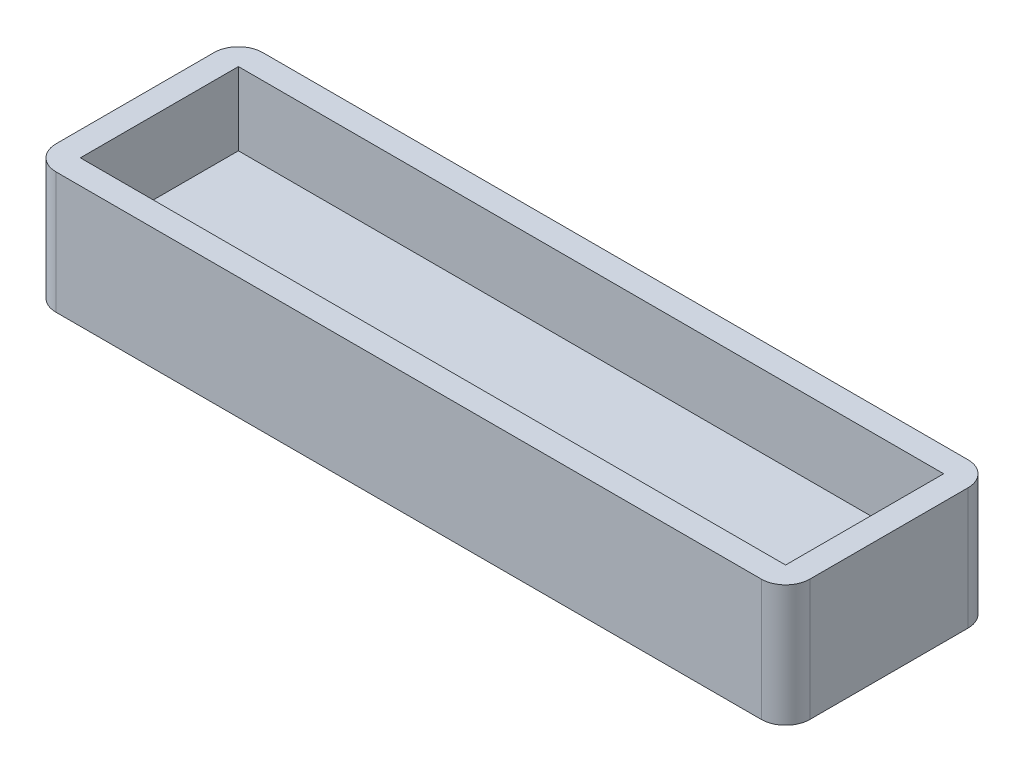
ISO-10303-21;
HEADER;
FILE_DESCRIPTION(('STEP AP214'),'2;1');
FILE_NAME('part.step','',(''),(''),'','','');
FILE_SCHEMA(('AUTOMOTIVE_DESIGN { 1 0 10303 214 1 1 1 1 }'));
ENDSEC;
DATA;
#1=APPLICATION_CONTEXT('core data for automotive mechanical design processes');
#2=APPLICATION_PROTOCOL_DEFINITION('international standard','automotive_design',2000,#1);
#3=PRODUCT_CONTEXT('',#1,'mechanical');
#4=PRODUCT('Part','Part','',(#3));
#5=PRODUCT_RELATED_PRODUCT_CATEGORY('part','',(#4));
#6=PRODUCT_DEFINITION_FORMATION('','',#4);
#7=PRODUCT_DEFINITION_CONTEXT('part definition',#1,'design');
#8=PRODUCT_DEFINITION('design','',#6,#7);
#9=PRODUCT_DEFINITION_SHAPE('','',#8);
#10=(LENGTH_UNIT() NAMED_UNIT(*) SI_UNIT(.MILLI.,.METRE.));
#11=(NAMED_UNIT(*) PLANE_ANGLE_UNIT() SI_UNIT($,.RADIAN.));
#12=(NAMED_UNIT(*) SI_UNIT($,.STERADIAN.) SOLID_ANGLE_UNIT());
#13=UNCERTAINTY_MEASURE_WITH_UNIT(LENGTH_MEASURE(1.E-05),#10,'distance_accuracy_value','');
#14=(GEOMETRIC_REPRESENTATION_CONTEXT(3) GLOBAL_UNCERTAINTY_ASSIGNED_CONTEXT((#13)) GLOBAL_UNIT_ASSIGNED_CONTEXT((#10,
#11,#12)) REPRESENTATION_CONTEXT('',''));
#15=CARTESIAN_POINT('',(0.,0.,0.));
#16=DIRECTION('',(0.,0.,1.));
#17=DIRECTION('',(1.,0.,0.));
#18=AXIS2_PLACEMENT_3D('',#15,#16,#17);
#19=CARTESIAN_POINT('',(0.,0.,85.));
#20=DIRECTION('',(1.,0.,0.));
#21=DIRECTION('',(0.,0.,-1.));
#22=AXIS2_PLACEMENT_3D('',#19,#20,#21);
#23=PLANE('',#22);
#24=DIRECTION('',(0.,0.,-1.));
#25=VECTOR('',#24,1.);
#26=CARTESIAN_POINT('',(0.,50.,85.));
#27=LINE('',#26,#25);
#28=CARTESIAN_POINT('',(0.,50.,75.));
#29=VERTEX_POINT('',#28);
#30=CARTESIAN_POINT('',(0.,50.,9.99999999999999));
#31=VERTEX_POINT('',#30);
#32=EDGE_CURVE('E257',#29,#31,#27,.T.);
#33=ORIENTED_EDGE('',*,*,#32,.T.);
#34=DIRECTION('',(0.,-1.,0.));
#35=VECTOR('',#34,1.);
#36=CARTESIAN_POINT('',(0.,0.,9.99999999999999));
#37=LINE('',#36,#35);
#38=CARTESIAN_POINT('',(0.,0.,9.99999999999999));
#39=VERTEX_POINT('',#38);
#40=EDGE_CURVE('E318',#31,#39,#37,.T.);
#41=ORIENTED_EDGE('',*,*,#40,.T.);
#42=DIRECTION('',(0.,0.,-1.));
#43=VECTOR('',#42,1.);
#44=CARTESIAN_POINT('',(0.,0.,85.));
#45=LINE('',#44,#43);
#46=CARTESIAN_POINT('',(0.,0.,75.));
#47=VERTEX_POINT('',#46);
#48=EDGE_CURVE('E272',#47,#39,#45,.T.);
#49=ORIENTED_EDGE('',*,*,#48,.F.);
#50=DIRECTION('',(0.,-1.,0.));
#51=VECTOR('',#50,1.);
#52=CARTESIAN_POINT('',(0.,0.,75.));
#53=LINE('',#52,#51);
#54=EDGE_CURVE('E312',#47,#29,#53,.F.);
#55=ORIENTED_EDGE('',*,*,#54,.T.);
#56=EDGE_LOOP('',(#33,#41,#49,#55));
#57=FACE_BOUND('',#56,.T.);
#58=ADVANCED_FACE('F39',(#57),#23,.F.);
#59=CARTESIAN_POINT('',(0.,0.,85.));
#60=DIRECTION('',(0.,1.,0.));
#61=DIRECTION('',(0.,0.,1.));
#62=AXIS2_PLACEMENT_3D('',#59,#60,#61);
#63=PLANE('',#62);
#64=ORIENTED_EDGE('',*,*,#48,.T.);
#65=CARTESIAN_POINT('',(10.,0.,9.99999999999999));
#66=DIRECTION('',(0.,1.,0.));
#67=DIRECTION('',(0.,0.,1.));
#68=AXIS2_PLACEMENT_3D('',#65,#66,#67);
#69=CIRCLE('',#68,10.);
#70=CARTESIAN_POINT('',(10.,0.,0.));
#71=VERTEX_POINT('',#70);
#72=EDGE_CURVE('E322',#39,#71,#69,.F.);
#73=ORIENTED_EDGE('',*,*,#72,.T.);
#74=DIRECTION('',(1.,0.,0.));
#75=VECTOR('',#74,1.);
#76=CARTESIAN_POINT('',(0.,0.,0.));
#77=LINE('',#76,#75);
#78=CARTESIAN_POINT('',(300.,0.,0.));
#79=VERTEX_POINT('',#78);
#80=EDGE_CURVE('E239',#71,#79,#77,.T.);
#81=ORIENTED_EDGE('',*,*,#80,.T.);
#82=CARTESIAN_POINT('',(300.,0.,9.99999999999999));
#83=DIRECTION('',(0.,1.,0.));
#84=DIRECTION('',(0.,0.,1.));
#85=AXIS2_PLACEMENT_3D('',#82,#83,#84);
#86=CIRCLE('',#85,10.);
#87=CARTESIAN_POINT('',(310.,0.,9.99999999999999));
#88=VERTEX_POINT('',#87);
#89=EDGE_CURVE('E287',#79,#88,#86,.F.);
#90=ORIENTED_EDGE('',*,*,#89,.T.);
#91=DIRECTION('',(0.,0.,-1.));
#92=VECTOR('',#91,1.);
#93=CARTESIAN_POINT('',(310.,0.,85.));
#94=LINE('',#93,#92);
#95=CARTESIAN_POINT('',(310.,0.,75.));
#96=VERTEX_POINT('',#95);
#97=EDGE_CURVE('E269',#96,#88,#94,.T.);
#98=ORIENTED_EDGE('',*,*,#97,.F.);
#99=CARTESIAN_POINT('',(300.,0.,75.));
#100=DIRECTION('',(0.,1.,0.));
#101=DIRECTION('',(0.,0.,1.));
#102=AXIS2_PLACEMENT_3D('',#99,#100,#101);
#103=CIRCLE('',#102,10.);
#104=CARTESIAN_POINT('',(300.,0.,85.));
#105=VERTEX_POINT('',#104);
#106=EDGE_CURVE('E301',#96,#105,#103,.F.);
#107=ORIENTED_EDGE('',*,*,#106,.T.);
#108=DIRECTION('',(1.,0.,0.));
#109=VECTOR('',#108,1.);
#110=CARTESIAN_POINT('',(0.,0.,85.));
#111=LINE('',#110,#109);
#112=CARTESIAN_POINT('',(10.,0.,85.));
#113=VERTEX_POINT('',#112);
#114=EDGE_CURVE('E249',#113,#105,#111,.T.);
#115=ORIENTED_EDGE('',*,*,#114,.F.);
#116=CARTESIAN_POINT('',(10.,0.,75.));
#117=DIRECTION('',(0.,1.,0.));
#118=DIRECTION('',(0.,0.,1.));
#119=AXIS2_PLACEMENT_3D('',#116,#117,#118);
#120=CIRCLE('',#119,10.);
#121=EDGE_CURVE('E309',#113,#47,#120,.F.);
#122=ORIENTED_EDGE('',*,*,#121,.T.);
#123=EDGE_LOOP('',(#64,#73,#81,#90,#98,#107,#115,#122));
#124=FACE_BOUND('',#123,.T.);
#125=ADVANCED_FACE('F342',(#124),#63,.F.);
#126=CARTESIAN_POINT('',(310.,0.,85.));
#127=DIRECTION('',(-1.,0.,0.));
#128=DIRECTION('',(0.,0.,1.));
#129=AXIS2_PLACEMENT_3D('',#126,#127,#128);
#130=PLANE('',#129);
#131=DIRECTION('',(0.,0.,-1.));
#132=VECTOR('',#131,1.);
#133=CARTESIAN_POINT('',(310.,50.,85.));
#134=LINE('',#133,#132);
#135=CARTESIAN_POINT('',(310.,50.,75.));
#136=VERTEX_POINT('',#135);
#137=CARTESIAN_POINT('',(310.,50.,9.99999999999999));
#138=VERTEX_POINT('',#137);
#139=EDGE_CURVE('E266',#136,#138,#134,.T.);
#140=ORIENTED_EDGE('',*,*,#139,.F.);
#141=DIRECTION('',(0.,1.,0.));
#142=VECTOR('',#141,1.);
#143=CARTESIAN_POINT('',(310.,0.,75.));
#144=LINE('',#143,#142);
#145=EDGE_CURVE('E298',#136,#96,#144,.F.);
#146=ORIENTED_EDGE('',*,*,#145,.T.);
#147=ORIENTED_EDGE('',*,*,#97,.T.);
#148=DIRECTION('',(0.,1.,0.));
#149=VECTOR('',#148,1.);
#150=CARTESIAN_POINT('',(310.,50.,9.99999999999999));
#151=LINE('',#150,#149);
#152=EDGE_CURVE('E276',#88,#138,#151,.T.);
#153=ORIENTED_EDGE('',*,*,#152,.T.);
#154=EDGE_LOOP('',(#140,#146,#147,#153));
#155=FACE_BOUND('',#154,.T.);
#156=ADVANCED_FACE('F356',(#155),#130,.F.);
#157=CARTESIAN_POINT('',(0.,50.,85.));
#158=DIRECTION('',(0.,-1.,0.));
#159=DIRECTION('',(0.,0.,-1.));
#160=AXIS2_PLACEMENT_3D('',#157,#158,#159);
#161=PLANE('',#160);
#162=DIRECTION('',(1.,0.,0.));
#163=VECTOR('',#162,1.);
#164=CARTESIAN_POINT('',(10.,50.,75.));
#165=LINE('',#164,#163);
#166=CARTESIAN_POINT('',(10.,50.,75.));
#167=VERTEX_POINT('',#166);
#168=CARTESIAN_POINT('',(300.,50.,75.));
#169=VERTEX_POINT('',#168);
#170=EDGE_CURVE('E225',#167,#169,#165,.T.);
#171=ORIENTED_EDGE('',*,*,#170,.F.);
#172=DIRECTION('',(0.,0.,1.));
#173=VECTOR('',#172,1.);
#174=CARTESIAN_POINT('',(10.,50.,10.));
#175=LINE('',#174,#173);
#176=CARTESIAN_POINT('',(10.,50.,10.));
#177=VERTEX_POINT('',#176);
#178=EDGE_CURVE('E199',#177,#167,#175,.T.);
#179=ORIENTED_EDGE('',*,*,#178,.F.);
#180=DIRECTION('',(-1.,0.,0.));
#181=VECTOR('',#180,1.);
#182=CARTESIAN_POINT('',(10.,50.,10.));
#183=LINE('',#182,#181);
#184=CARTESIAN_POINT('',(300.,50.,10.));
#185=VERTEX_POINT('',#184);
#186=EDGE_CURVE('E210',#185,#177,#183,.T.);
#187=ORIENTED_EDGE('',*,*,#186,.F.);
#188=DIRECTION('',(0.,0.,-1.));
#189=VECTOR('',#188,1.);
#190=CARTESIAN_POINT('',(300.,50.,10.));
#191=LINE('',#190,#189);
#192=EDGE_CURVE('E229',#169,#185,#191,.T.);
#193=ORIENTED_EDGE('',*,*,#192,.F.);
#194=EDGE_LOOP('',(#171,#179,#187,#193));
#195=FACE_BOUND('',#194,.T.);
#196=DIRECTION('',(-1.,0.,0.));
#197=VECTOR('',#196,1.);
#198=CARTESIAN_POINT('',(0.,50.,0.));
#199=LINE('',#198,#197);
#200=CARTESIAN_POINT('',(300.,50.,0.));
#201=VERTEX_POINT('',#200);
#202=CARTESIAN_POINT('',(10.,50.,0.));
#203=VERTEX_POINT('',#202);
#204=EDGE_CURVE('E253',#201,#203,#199,.T.);
#205=ORIENTED_EDGE('',*,*,#204,.T.);
#206=CARTESIAN_POINT('',(10.,50.,9.99999999999999));
#207=DIRECTION('',(0.,-1.,0.));
#208=DIRECTION('',(0.,0.,-1.));
#209=AXIS2_PLACEMENT_3D('',#206,#207,#208);
#210=CIRCLE('',#209,10.);
#211=EDGE_CURVE('E11',#203,#31,#210,.F.);
#212=ORIENTED_EDGE('',*,*,#211,.T.);
#213=ORIENTED_EDGE('',*,*,#32,.F.);
#214=CARTESIAN_POINT('',(10.,50.,75.));
#215=DIRECTION('',(0.,-1.,0.));
#216=DIRECTION('',(0.,0.,-1.));
#217=AXIS2_PLACEMENT_3D('',#214,#215,#216);
#218=CIRCLE('',#217,10.);
#219=CARTESIAN_POINT('',(10.,50.,85.));
#220=VERTEX_POINT('',#219);
#221=EDGE_CURVE('E315',#29,#220,#218,.F.);
#222=ORIENTED_EDGE('',*,*,#221,.T.);
#223=DIRECTION('',(-1.,0.,0.));
#224=VECTOR('',#223,1.);
#225=CARTESIAN_POINT('',(0.,50.,85.));
#226=LINE('',#225,#224);
#227=CARTESIAN_POINT('',(300.,50.,85.));
#228=VERTEX_POINT('',#227);
#229=EDGE_CURVE('E252',#228,#220,#226,.T.);
#230=ORIENTED_EDGE('',*,*,#229,.F.);
#231=CARTESIAN_POINT('',(300.,50.,75.));
#232=DIRECTION('',(0.,-1.,0.));
#233=DIRECTION('',(0.,0.,-1.));
#234=AXIS2_PLACEMENT_3D('',#231,#232,#233);
#235=CIRCLE('',#234,10.);
#236=EDGE_CURVE('E295',#228,#136,#235,.F.);
#237=ORIENTED_EDGE('',*,*,#236,.T.);
#238=ORIENTED_EDGE('',*,*,#139,.T.);
#239=CARTESIAN_POINT('',(300.,50.,9.99999999999999));
#240=DIRECTION('',(0.,-1.,0.));
#241=DIRECTION('',(0.,0.,-1.));
#242=AXIS2_PLACEMENT_3D('',#239,#240,#241);
#243=CIRCLE('',#242,10.);
#244=EDGE_CURVE('E280',#138,#201,#243,.F.);
#245=ORIENTED_EDGE('',*,*,#244,.T.);
#246=EDGE_LOOP('',(#205,#212,#213,#222,#230,#237,#238,#245));
#247=FACE_BOUND('',#246,.T.);
#248=ADVANCED_FACE('F334',(#195,#247),#161,.F.);
#249=CARTESIAN_POINT('',(0.,0.,85.));
#250=DIRECTION('',(0.,0.,-1.));
#251=DIRECTION('',(-1.,0.,0.));
#252=AXIS2_PLACEMENT_3D('',#249,#250,#251);
#253=PLANE('',#252);
#254=ORIENTED_EDGE('',*,*,#229,.T.);
#255=DIRECTION('',(0.,-1.,0.));
#256=VECTOR('',#255,1.);
#257=CARTESIAN_POINT('',(10.,0.,85.));
#258=LINE('',#257,#256);
#259=EDGE_CURVE('E305',#220,#113,#258,.T.);
#260=ORIENTED_EDGE('',*,*,#259,.T.);
#261=ORIENTED_EDGE('',*,*,#114,.T.);
#262=DIRECTION('',(0.,1.,0.));
#263=VECTOR('',#262,1.);
#264=CARTESIAN_POINT('',(300.,0.,85.));
#265=LINE('',#264,#263);
#266=EDGE_CURVE('E291',#105,#228,#265,.T.);
#267=ORIENTED_EDGE('',*,*,#266,.T.);
#268=EDGE_LOOP('',(#254,#260,#261,#267));
#269=FACE_BOUND('',#268,.T.);
#270=ADVANCED_FACE('F349',(#269),#253,.F.);
#271=CARTESIAN_POINT('',(0.,0.,0.));
#272=DIRECTION('',(0.,0.,-1.));
#273=DIRECTION('',(-1.,0.,0.));
#274=AXIS2_PLACEMENT_3D('',#271,#272,#273);
#275=PLANE('',#274);
#276=DIRECTION('',(0.,-1.,0.));
#277=VECTOR('',#276,1.);
#278=CARTESIAN_POINT('',(290.,29.,0.));
#279=LINE('',#278,#277);
#280=CARTESIAN_POINT('',(290.,29.,0.));
#281=VERTEX_POINT('',#280);
#282=CARTESIAN_POINT('',(290.,25.,0.));
#283=VERTEX_POINT('',#282);
#284=EDGE_CURVE('E55',#281,#283,#279,.T.);
#285=ORIENTED_EDGE('',*,*,#284,.F.);
#286=DIRECTION('',(1.,0.,0.));
#287=VECTOR('',#286,1.);
#288=CARTESIAN_POINT('',(290.,29.,0.));
#289=LINE('',#288,#287);
#290=CARTESIAN_POINT('',(282.,29.,0.));
#291=VERTEX_POINT('',#290);
#292=EDGE_CURVE('E173',#291,#281,#289,.T.);
#293=ORIENTED_EDGE('',*,*,#292,.F.);
#294=DIRECTION('',(0.,1.,0.));
#295=VECTOR('',#294,1.);
#296=CARTESIAN_POINT('',(282.,29.,0.));
#297=LINE('',#296,#295);
#298=CARTESIAN_POINT('',(282.,25.,0.));
#299=VERTEX_POINT('',#298);
#300=EDGE_CURVE('E177',#299,#291,#297,.T.);
#301=ORIENTED_EDGE('',*,*,#300,.F.);
#302=DIRECTION('',(-1.,0.,0.));
#303=VECTOR('',#302,1.);
#304=CARTESIAN_POINT('',(290.,25.,0.));
#305=LINE('',#304,#303);
#306=EDGE_CURVE('E189',#283,#299,#305,.T.);
#307=ORIENTED_EDGE('',*,*,#306,.F.);
#308=EDGE_LOOP('',(#285,#293,#301,#307));
#309=FACE_BOUND('',#308,.T.);
#310=ORIENTED_EDGE('',*,*,#80,.F.);
#311=DIRECTION('',(0.,-1.,0.));
#312=VECTOR('',#311,1.);
#313=CARTESIAN_POINT('',(10.,50.,0.));
#314=LINE('',#313,#312);
#315=EDGE_CURVE('E48',#71,#203,#314,.F.);
#316=ORIENTED_EDGE('',*,*,#315,.T.);
#317=ORIENTED_EDGE('',*,*,#204,.F.);
#318=DIRECTION('',(0.,1.,0.));
#319=VECTOR('',#318,1.);
#320=CARTESIAN_POINT('',(300.,0.,0.));
#321=LINE('',#320,#319);
#322=EDGE_CURVE('E283',#201,#79,#321,.F.);
#323=ORIENTED_EDGE('',*,*,#322,.T.);
#324=EDGE_LOOP('',(#310,#316,#317,#323));
#325=FACE_BOUND('',#324,.T.);
#326=ADVANCED_FACE('F329',(#309,#325),#275,.T.);
#327=CARTESIAN_POINT('',(10.,20.,10.));
#328=DIRECTION('',(-1.,0.,0.));
#329=DIRECTION('',(0.,0.,1.));
#330=AXIS2_PLACEMENT_3D('',#327,#328,#329);
#331=PLANE('',#330);
#332=ORIENTED_EDGE('',*,*,#178,.T.);
#333=DIRECTION('',(0.,1.,0.));
#334=VECTOR('',#333,1.);
#335=CARTESIAN_POINT('',(10.,20.,75.));
#336=LINE('',#335,#334);
#337=CARTESIAN_POINT('',(10.,20.,75.));
#338=VERTEX_POINT('',#337);
#339=EDGE_CURVE('E222',#338,#167,#336,.T.);
#340=ORIENTED_EDGE('',*,*,#339,.F.);
#341=DIRECTION('',(0.,0.,1.));
#342=VECTOR('',#341,1.);
#343=CARTESIAN_POINT('',(10.,20.,10.));
#344=LINE('',#343,#342);
#345=CARTESIAN_POINT('',(10.,20.,10.));
#346=VERTEX_POINT('',#345);
#347=EDGE_CURVE('E205',#346,#338,#344,.T.);
#348=ORIENTED_EDGE('',*,*,#347,.F.);
#349=DIRECTION('',(0.,1.,0.));
#350=VECTOR('',#349,1.);
#351=CARTESIAN_POINT('',(10.,20.,10.));
#352=LINE('',#351,#350);
#353=EDGE_CURVE('E236',#346,#177,#352,.T.);
#354=ORIENTED_EDGE('',*,*,#353,.T.);
#355=EDGE_LOOP('',(#332,#340,#348,#354));
#356=FACE_BOUND('',#355,.T.);
#357=ADVANCED_FACE('F389',(#356),#331,.F.);
#358=CARTESIAN_POINT('',(10.,20.,10.));
#359=DIRECTION('',(0.,0.,-1.));
#360=DIRECTION('',(-1.,0.,0.));
#361=AXIS2_PLACEMENT_3D('',#358,#359,#360);
#362=PLANE('',#361);
#363=DIRECTION('',(1.,0.,0.));
#364=VECTOR('',#363,1.);
#365=CARTESIAN_POINT('',(290.,29.,10.));
#366=LINE('',#365,#364);
#367=CARTESIAN_POINT('',(282.,29.,10.));
#368=VERTEX_POINT('',#367);
#369=CARTESIAN_POINT('',(290.,29.,10.));
#370=VERTEX_POINT('',#369);
#371=EDGE_CURVE('E161',#368,#370,#366,.T.);
#372=ORIENTED_EDGE('',*,*,#371,.T.);
#373=DIRECTION('',(0.,-1.,0.));
#374=VECTOR('',#373,1.);
#375=CARTESIAN_POINT('',(290.,29.,10.));
#376=LINE('',#375,#374);
#377=CARTESIAN_POINT('',(290.,25.,10.));
#378=VERTEX_POINT('',#377);
#379=EDGE_CURVE('E154',#370,#378,#376,.T.);
#380=ORIENTED_EDGE('',*,*,#379,.T.);
#381=DIRECTION('',(-1.,0.,0.));
#382=VECTOR('',#381,1.);
#383=CARTESIAN_POINT('',(290.,25.,10.));
#384=LINE('',#383,#382);
#385=CARTESIAN_POINT('',(282.,25.,10.));
#386=VERTEX_POINT('',#385);
#387=EDGE_CURVE('E164',#378,#386,#384,.T.);
#388=ORIENTED_EDGE('',*,*,#387,.T.);
#389=DIRECTION('',(0.,1.,0.));
#390=VECTOR('',#389,1.);
#391=CARTESIAN_POINT('',(282.,29.,10.));
#392=LINE('',#391,#390);
#393=EDGE_CURVE('E63',#386,#368,#392,.T.);
#394=ORIENTED_EDGE('',*,*,#393,.T.);
#395=EDGE_LOOP('',(#372,#380,#388,#394));
#396=FACE_BOUND('',#395,.T.);
#397=ORIENTED_EDGE('',*,*,#186,.T.);
#398=ORIENTED_EDGE('',*,*,#353,.F.);
#399=DIRECTION('',(-1.,0.,0.));
#400=VECTOR('',#399,1.);
#401=CARTESIAN_POINT('',(10.,20.,10.));
#402=LINE('',#401,#400);
#403=CARTESIAN_POINT('',(300.,20.,10.));
#404=VERTEX_POINT('',#403);
#405=EDGE_CURVE('E218',#404,#346,#402,.T.);
#406=ORIENTED_EDGE('',*,*,#405,.F.);
#407=DIRECTION('',(0.,1.,0.));
#408=VECTOR('',#407,1.);
#409=CARTESIAN_POINT('',(300.,20.,10.));
#410=LINE('',#409,#408);
#411=EDGE_CURVE('E240',#404,#185,#410,.T.);
#412=ORIENTED_EDGE('',*,*,#411,.T.);
#413=EDGE_LOOP('',(#397,#398,#406,#412));
#414=FACE_BOUND('',#413,.T.);
#415=ADVANCED_FACE('F169',(#396,#414),#362,.F.);
#416=CARTESIAN_POINT('',(300.,20.,10.));
#417=DIRECTION('',(1.,0.,0.));
#418=DIRECTION('',(0.,0.,-1.));
#419=AXIS2_PLACEMENT_3D('',#416,#417,#418);
#420=PLANE('',#419);
#421=ORIENTED_EDGE('',*,*,#192,.T.);
#422=ORIENTED_EDGE('',*,*,#411,.F.);
#423=DIRECTION('',(0.,0.,-1.));
#424=VECTOR('',#423,1.);
#425=CARTESIAN_POINT('',(300.,20.,10.));
#426=LINE('',#425,#424);
#427=CARTESIAN_POINT('',(300.,20.,75.));
#428=VERTEX_POINT('',#427);
#429=EDGE_CURVE('E214',#428,#404,#426,.T.);
#430=ORIENTED_EDGE('',*,*,#429,.F.);
#431=DIRECTION('',(0.,1.,0.));
#432=VECTOR('',#431,1.);
#433=CARTESIAN_POINT('',(300.,20.,75.));
#434=LINE('',#433,#432);
#435=EDGE_CURVE('E243',#428,#169,#434,.T.);
#436=ORIENTED_EDGE('',*,*,#435,.T.);
#437=EDGE_LOOP('',(#421,#422,#430,#436));
#438=FACE_BOUND('',#437,.T.);
#439=ADVANCED_FACE('F398',(#438),#420,.F.);
#440=CARTESIAN_POINT('',(10.,20.,75.));
#441=DIRECTION('',(0.,0.,1.));
#442=DIRECTION('',(1.,0.,0.));
#443=AXIS2_PLACEMENT_3D('',#440,#441,#442);
#444=PLANE('',#443);
#445=ORIENTED_EDGE('',*,*,#170,.T.);
#446=ORIENTED_EDGE('',*,*,#435,.F.);
#447=DIRECTION('',(1.,0.,0.));
#448=VECTOR('',#447,1.);
#449=CARTESIAN_POINT('',(10.,20.,75.));
#450=LINE('',#449,#448);
#451=EDGE_CURVE('E209',#338,#428,#450,.T.);
#452=ORIENTED_EDGE('',*,*,#451,.F.);
#453=ORIENTED_EDGE('',*,*,#339,.T.);
#454=EDGE_LOOP('',(#445,#446,#452,#453));
#455=FACE_BOUND('',#454,.T.);
#456=ADVANCED_FACE('F372',(#455),#444,.F.);
#457=CARTESIAN_POINT('',(0.,20.,0.));
#458=DIRECTION('',(0.,1.,0.));
#459=DIRECTION('',(0.,0.,1.));
#460=AXIS2_PLACEMENT_3D('',#457,#458,#459);
#461=PLANE('',#460);
#462=CARTESIAN_POINT('',(286.,20.,15.));
#463=DIRECTION('',(0.,1.,0.));
#464=DIRECTION('',(0.,0.,1.));
#465=AXIS2_PLACEMENT_3D('',#462,#463,#464);
#466=CIRCLE('',#465,1.50000000000002);
#467=CARTESIAN_POINT('',(286.,20.,16.5));
#468=VERTEX_POINT('',#467);
#469=EDGE_CURVE('E436',#468,#468,#466,.T.);
#470=ORIENTED_EDGE('',*,*,#469,.F.);
#471=EDGE_LOOP('',(#470));
#472=FACE_BOUND('',#471,.T.);
#473=CARTESIAN_POINT('',(286.,20.,70.));
#474=DIRECTION('',(0.,1.,0.));
#475=DIRECTION('',(0.,0.,1.));
#476=AXIS2_PLACEMENT_3D('',#473,#474,#475);
#477=CIRCLE('',#476,1.50000000000002);
#478=CARTESIAN_POINT('',(286.,20.,71.5));
#479=VERTEX_POINT('',#478);
#480=EDGE_CURVE('E180',#479,#479,#477,.T.);
#481=ORIENTED_EDGE('',*,*,#480,.F.);
#482=EDGE_LOOP('',(#481));
#483=FACE_BOUND('',#482,.T.);
#484=ORIENTED_EDGE('',*,*,#347,.T.);
#485=ORIENTED_EDGE('',*,*,#451,.T.);
#486=ORIENTED_EDGE('',*,*,#429,.T.);
#487=ORIENTED_EDGE('',*,*,#405,.T.);
#488=EDGE_LOOP('',(#484,#485,#486,#487));
#489=FACE_BOUND('',#488,.T.);
#490=ADVANCED_FACE('F365',(#472,#483,#489),#461,.T.);
#491=CARTESIAN_POINT('',(300.,0.,9.99999999999999));
#492=DIRECTION('',(0.,-1.,0.));
#493=DIRECTION('',(0.,0.,-1.));
#494=AXIS2_PLACEMENT_3D('',#491,#492,#493);
#495=CYLINDRICAL_SURFACE('',#494,10.);
#496=ORIENTED_EDGE('',*,*,#89,.F.);
#497=ORIENTED_EDGE('',*,*,#322,.F.);
#498=ORIENTED_EDGE('',*,*,#244,.F.);
#499=ORIENTED_EDGE('',*,*,#152,.F.);
#500=EDGE_LOOP('',(#496,#497,#498,#499));
#501=FACE_BOUND('',#500,.T.);
#502=ADVANCED_FACE('F363',(#501),#495,.T.);
#503=CARTESIAN_POINT('',(300.,0.,75.));
#504=DIRECTION('',(0.,1.,0.));
#505=DIRECTION('',(0.,0.,1.));
#506=AXIS2_PLACEMENT_3D('',#503,#504,#505);
#507=CYLINDRICAL_SURFACE('',#506,10.);
#508=ORIENTED_EDGE('',*,*,#106,.F.);
#509=ORIENTED_EDGE('',*,*,#145,.F.);
#510=ORIENTED_EDGE('',*,*,#236,.F.);
#511=ORIENTED_EDGE('',*,*,#266,.F.);
#512=EDGE_LOOP('',(#508,#509,#510,#511));
#513=FACE_BOUND('',#512,.T.);
#514=ADVANCED_FACE('F360',(#513),#507,.T.);
#515=CARTESIAN_POINT('',(10.,0.,75.));
#516=DIRECTION('',(0.,-1.,0.));
#517=DIRECTION('',(0.,0.,-1.));
#518=AXIS2_PLACEMENT_3D('',#515,#516,#517);
#519=CYLINDRICAL_SURFACE('',#518,10.);
#520=ORIENTED_EDGE('',*,*,#221,.F.);
#521=ORIENTED_EDGE('',*,*,#54,.F.);
#522=ORIENTED_EDGE('',*,*,#121,.F.);
#523=ORIENTED_EDGE('',*,*,#259,.F.);
#524=EDGE_LOOP('',(#520,#521,#522,#523));
#525=FACE_BOUND('',#524,.T.);
#526=ADVANCED_FACE('F347',(#525),#519,.T.);
#527=CARTESIAN_POINT('',(10.,0.,9.99999999999999));
#528=DIRECTION('',(0.,1.,0.));
#529=DIRECTION('',(0.,0.,1.));
#530=AXIS2_PLACEMENT_3D('',#527,#528,#529);
#531=CYLINDRICAL_SURFACE('',#530,10.);
#532=ORIENTED_EDGE('',*,*,#211,.F.);
#533=ORIENTED_EDGE('',*,*,#315,.F.);
#534=ORIENTED_EDGE('',*,*,#72,.F.);
#535=ORIENTED_EDGE('',*,*,#40,.F.);
#536=EDGE_LOOP('',(#532,#533,#534,#535));
#537=FACE_BOUND('',#536,.T.);
#538=ADVANCED_FACE('F41',(#537),#531,.T.);
#539=CARTESIAN_POINT('',(290.,29.,10.));
#540=DIRECTION('',(1.,0.,0.));
#541=DIRECTION('',(0.,0.,-1.));
#542=AXIS2_PLACEMENT_3D('',#539,#540,#541);
#543=PLANE('',#542);
#544=ORIENTED_EDGE('',*,*,#284,.T.);
#545=DIRECTION('',(0.,0.,-1.));
#546=VECTOR('',#545,1.);
#547=CARTESIAN_POINT('',(290.,25.,10.));
#548=LINE('',#547,#546);
#549=EDGE_CURVE('E150',#378,#283,#548,.T.);
#550=ORIENTED_EDGE('',*,*,#549,.F.);
#551=ORIENTED_EDGE('',*,*,#379,.F.);
#552=DIRECTION('',(0.,0.,-1.));
#553=VECTOR('',#552,1.);
#554=CARTESIAN_POINT('',(290.,29.,10.));
#555=LINE('',#554,#553);
#556=EDGE_CURVE('E196',#370,#281,#555,.T.);
#557=ORIENTED_EDGE('',*,*,#556,.T.);
#558=EDGE_LOOP('',(#544,#550,#551,#557));
#559=FACE_BOUND('',#558,.T.);
#560=ADVANCED_FACE('F152',(#559),#543,.F.);
#561=CARTESIAN_POINT('',(290.,29.,10.));
#562=DIRECTION('',(0.,1.,0.));
#563=DIRECTION('',(0.,0.,1.));
#564=AXIS2_PLACEMENT_3D('',#561,#562,#563);
#565=PLANE('',#564);
#566=ORIENTED_EDGE('',*,*,#292,.T.);
#567=ORIENTED_EDGE('',*,*,#556,.F.);
#568=ORIENTED_EDGE('',*,*,#371,.F.);
#569=DIRECTION('',(0.,0.,-1.));
#570=VECTOR('',#569,1.);
#571=CARTESIAN_POINT('',(282.,29.,10.));
#572=LINE('',#571,#570);
#573=EDGE_CURVE('E200',#368,#291,#572,.T.);
#574=ORIENTED_EDGE('',*,*,#573,.T.);
#575=EDGE_LOOP('',(#566,#567,#568,#574));
#576=FACE_BOUND('',#575,.T.);
#577=ADVANCED_FACE('F407',(#576),#565,.F.);
#578=CARTESIAN_POINT('',(282.,29.,10.));
#579=DIRECTION('',(-1.,0.,0.));
#580=DIRECTION('',(0.,0.,1.));
#581=AXIS2_PLACEMENT_3D('',#578,#579,#580);
#582=PLANE('',#581);
#583=ORIENTED_EDGE('',*,*,#300,.T.);
#584=ORIENTED_EDGE('',*,*,#573,.F.);
#585=ORIENTED_EDGE('',*,*,#393,.F.);
#586=DIRECTION('',(0.,0.,-1.));
#587=VECTOR('',#586,1.);
#588=CARTESIAN_POINT('',(282.,25.,10.));
#589=LINE('',#588,#587);
#590=EDGE_CURVE('E160',#386,#299,#589,.T.);
#591=ORIENTED_EDGE('',*,*,#590,.T.);
#592=EDGE_LOOP('',(#583,#584,#585,#591));
#593=FACE_BOUND('',#592,.T.);
#594=ADVANCED_FACE('F411',(#593),#582,.F.);
#595=CARTESIAN_POINT('',(290.,25.,10.));
#596=DIRECTION('',(0.,-1.,0.));
#597=DIRECTION('',(0.,0.,-1.));
#598=AXIS2_PLACEMENT_3D('',#595,#596,#597);
#599=PLANE('',#598);
#600=ORIENTED_EDGE('',*,*,#306,.T.);
#601=ORIENTED_EDGE('',*,*,#590,.F.);
#602=ORIENTED_EDGE('',*,*,#387,.F.);
#603=ORIENTED_EDGE('',*,*,#549,.T.);
#604=EDGE_LOOP('',(#600,#601,#602,#603));
#605=FACE_BOUND('',#604,.T.);
#606=ADVANCED_FACE('F165',(#605),#599,.F.);
#607=CARTESIAN_POINT('',(286.,14.,70.));
#608=DIRECTION('',(0.,1.,0.));
#609=DIRECTION('',(0.,0.,1.));
#610=AXIS2_PLACEMENT_3D('',#607,#608,#609);
#611=CYLINDRICAL_SURFACE('',#610,1.50000000000002);
#612=CARTESIAN_POINT('',(286.,14.,70.));
#613=DIRECTION('',(0.,1.,0.));
#614=DIRECTION('',(0.,0.,1.));
#615=AXIS2_PLACEMENT_3D('',#612,#613,#614);
#616=CIRCLE('',#615,1.50000000000002);
#617=CARTESIAN_POINT('',(286.,14.,71.5));
#618=VERTEX_POINT('',#617);
#619=EDGE_CURVE('E440',#618,#618,#616,.T.);
#620=ORIENTED_EDGE('',*,*,#619,.F.);
#621=EDGE_LOOP('',(#620));
#622=FACE_BOUND('',#621,.T.);
#623=ORIENTED_EDGE('',*,*,#480,.T.);
#624=EDGE_LOOP('',(#623));
#625=FACE_BOUND('',#624,.T.);
#626=ADVANCED_FACE('F410',(#622,#625),#611,.F.);
#627=CARTESIAN_POINT('',(286.,14.,70.));
#628=DIRECTION('',(0.,1.,0.));
#629=DIRECTION('',(0.,0.,1.));
#630=AXIS2_PLACEMENT_3D('',#627,#628,#629);
#631=PLANE('',#630);
#632=ORIENTED_EDGE('',*,*,#619,.T.);
#633=EDGE_LOOP('',(#632));
#634=FACE_BOUND('',#633,.T.);
#635=ADVANCED_FACE('F419',(#634),#631,.T.);
#636=CARTESIAN_POINT('',(286.,14.,15.));
#637=DIRECTION('',(0.,1.,0.));
#638=DIRECTION('',(0.,0.,1.));
#639=AXIS2_PLACEMENT_3D('',#636,#637,#638);
#640=CYLINDRICAL_SURFACE('',#639,1.50000000000002);
#641=CARTESIAN_POINT('',(286.,14.,15.));
#642=DIRECTION('',(0.,1.,0.));
#643=DIRECTION('',(0.,0.,1.));
#644=AXIS2_PLACEMENT_3D('',#641,#642,#643);
#645=CIRCLE('',#644,1.50000000000002);
#646=CARTESIAN_POINT('',(286.,14.,16.5));
#647=VERTEX_POINT('',#646);
#648=EDGE_CURVE('E190',#647,#647,#645,.T.);
#649=ORIENTED_EDGE('',*,*,#648,.F.);
#650=EDGE_LOOP('',(#649));
#651=FACE_BOUND('',#650,.T.);
#652=ORIENTED_EDGE('',*,*,#469,.T.);
#653=EDGE_LOOP('',(#652));
#654=FACE_BOUND('',#653,.T.);
#655=ADVANCED_FACE('F423',(#651,#654),#640,.F.);
#656=CARTESIAN_POINT('',(286.,14.,15.));
#657=DIRECTION('',(0.,1.,0.));
#658=DIRECTION('',(0.,0.,1.));
#659=AXIS2_PLACEMENT_3D('',#656,#657,#658);
#660=PLANE('',#659);
#661=ORIENTED_EDGE('',*,*,#648,.T.);
#662=EDGE_LOOP('',(#661));
#663=FACE_BOUND('',#662,.T.);
#664=ADVANCED_FACE('F427',(#663),#660,.T.);
#665=CLOSED_SHELL('',(#58,#125,#156,#248,#270,#326,#357,#415,#439,#456,#490,#502,#514,#526,#538,
#560,#577,#594,#606,#626,#635,#655,#664));
#666=MANIFOLD_SOLID_BREP('B2',#665);
#667=ADVANCED_BREP_SHAPE_REPRESENTATION('',(#18,#666),#14);
#668=SHAPE_DEFINITION_REPRESENTATION(#9,#667);
ENDSEC;
END-ISO-10303-21;
